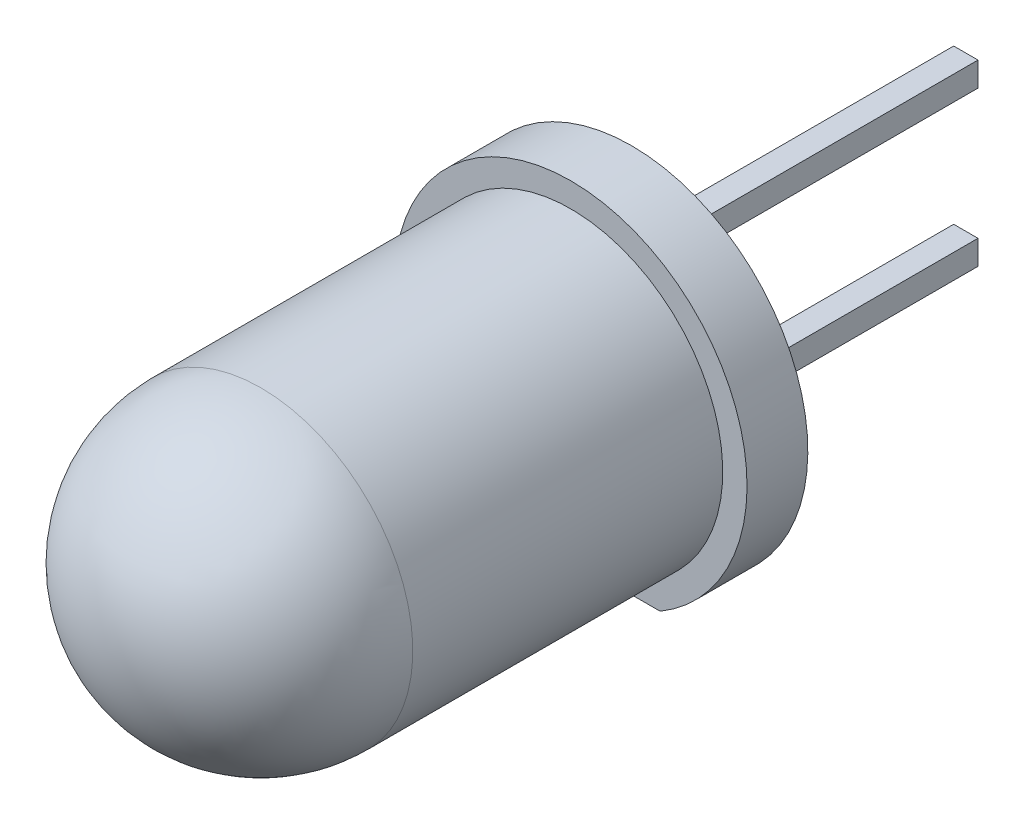
ISO-10303-21;
HEADER;
FILE_DESCRIPTION(('STEP AP214'),'2;1');
FILE_NAME('part.step','',(''),(''),'','','');
FILE_SCHEMA(('AUTOMOTIVE_DESIGN { 1 0 10303 214 1 1 1 1 }'));
ENDSEC;
DATA;
#1=APPLICATION_CONTEXT('core data for automotive mechanical design processes');
#2=APPLICATION_PROTOCOL_DEFINITION('international standard','automotive_design',2000,#1);
#3=PRODUCT_CONTEXT('',#1,'mechanical');
#4=PRODUCT('Part','Part','',(#3));
#5=PRODUCT_RELATED_PRODUCT_CATEGORY('part','',(#4));
#6=PRODUCT_DEFINITION_FORMATION('','',#4);
#7=PRODUCT_DEFINITION_CONTEXT('part definition',#1,'design');
#8=PRODUCT_DEFINITION('design','',#6,#7);
#9=PRODUCT_DEFINITION_SHAPE('','',#8);
#10=(LENGTH_UNIT() NAMED_UNIT(*) SI_UNIT(.MILLI.,.METRE.));
#11=(NAMED_UNIT(*) PLANE_ANGLE_UNIT() SI_UNIT($,.RADIAN.));
#12=(NAMED_UNIT(*) SI_UNIT($,.STERADIAN.) SOLID_ANGLE_UNIT());
#13=UNCERTAINTY_MEASURE_WITH_UNIT(LENGTH_MEASURE(1.E-05),#10,'distance_accuracy_value','');
#14=(GEOMETRIC_REPRESENTATION_CONTEXT(3) GLOBAL_UNCERTAINTY_ASSIGNED_CONTEXT((#13)) GLOBAL_UNIT_ASSIGNED_CONTEXT((#10,
#11,#12)) REPRESENTATION_CONTEXT('',''));
#15=CARTESIAN_POINT('',(0.,0.,0.));
#16=DIRECTION('',(0.,0.,1.));
#17=DIRECTION('',(1.,0.,0.));
#18=AXIS2_PLACEMENT_3D('',#15,#16,#17);
#19=CARTESIAN_POINT('',(9.2,-6.26,3.5));
#20=DIRECTION('',(-1.,0.,0.));
#21=DIRECTION('',(0.,-1.,0.));
#22=AXIS2_PLACEMENT_3D('',#19,#20,#21);
#23=PLANE('',#22);
#24=DIRECTION('',(0.,1.,0.));
#25=VECTOR('',#24,1.);
#26=CARTESIAN_POINT('',(9.2,-6.66,-2.5));
#27=LINE('',#26,#25);
#28=CARTESIAN_POINT('',(9.2,-6.66,-2.5));
#29=VERTEX_POINT('',#28);
#30=CARTESIAN_POINT('',(9.2,-6.26,-2.5));
#31=VERTEX_POINT('',#30);
#32=EDGE_CURVE('E117',#29,#31,#27,.T.);
#33=ORIENTED_EDGE('',*,*,#32,.T.);
#34=DIRECTION('',(0.,0.,1.));
#35=VECTOR('',#34,1.);
#36=CARTESIAN_POINT('',(9.2,-6.26,3.5));
#37=LINE('',#36,#35);
#38=CARTESIAN_POINT('',(9.2,-6.26,3.));
#39=VERTEX_POINT('',#38);
#40=EDGE_CURVE('E109',#31,#39,#37,.T.);
#41=ORIENTED_EDGE('',*,*,#40,.T.);
#42=DIRECTION('',(0.,-1.,0.));
#43=VECTOR('',#42,1.);
#44=CARTESIAN_POINT('',(9.2,-6.26,3.));
#45=LINE('',#44,#43);
#46=CARTESIAN_POINT('',(9.2,-6.66,3.));
#47=VERTEX_POINT('',#46);
#48=EDGE_CURVE('E99',#47,#39,#45,.F.);
#49=ORIENTED_EDGE('',*,*,#48,.F.);
#50=DIRECTION('',(0.,0.,1.));
#51=VECTOR('',#50,1.);
#52=CARTESIAN_POINT('',(9.2,-6.66,3.5));
#53=LINE('',#52,#51);
#54=EDGE_CURVE('E89',#47,#29,#53,.F.);
#55=ORIENTED_EDGE('',*,*,#54,.T.);
#56=EDGE_LOOP('',(#33,#41,#49,#55));
#57=FACE_BOUND('',#56,.T.);
#58=ADVANCED_FACE('F17',(#57),#23,.F.);
#59=CARTESIAN_POINT('',(9.2,-4.12,3.5));
#60=DIRECTION('',(0.,1.,0.));
#61=DIRECTION('',(-1.,0.,0.));
#62=AXIS2_PLACEMENT_3D('',#59,#60,#61);
#63=PLANE('',#62);
#64=DIRECTION('',(1.,0.,0.));
#65=VECTOR('',#64,1.);
#66=CARTESIAN_POINT('',(8.8,-4.12,-2.5));
#67=LINE('',#66,#65);
#68=CARTESIAN_POINT('',(8.8,-4.12,-2.5));
#69=VERTEX_POINT('',#68);
#70=CARTESIAN_POINT('',(9.2,-4.12,-2.5));
#71=VERTEX_POINT('',#70);
#72=EDGE_CURVE('E68',#69,#71,#67,.T.);
#73=ORIENTED_EDGE('',*,*,#72,.T.);
#74=DIRECTION('',(0.,0.,1.));
#75=VECTOR('',#74,1.);
#76=CARTESIAN_POINT('',(9.2,-4.12,3.5));
#77=LINE('',#76,#75);
#78=CARTESIAN_POINT('',(9.2,-4.12,3.));
#79=VERTEX_POINT('',#78);
#80=EDGE_CURVE('E162',#71,#79,#77,.T.);
#81=ORIENTED_EDGE('',*,*,#80,.T.);
#82=DIRECTION('',(-1.,0.,0.));
#83=VECTOR('',#82,1.);
#84=CARTESIAN_POINT('',(9.2,-4.12,3.));
#85=LINE('',#84,#83);
#86=CARTESIAN_POINT('',(8.8,-4.12,3.));
#87=VERTEX_POINT('',#86);
#88=EDGE_CURVE('E106',#87,#79,#85,.F.);
#89=ORIENTED_EDGE('',*,*,#88,.F.);
#90=DIRECTION('',(0.,0.,1.));
#91=VECTOR('',#90,1.);
#92=CARTESIAN_POINT('',(8.8,-4.12,3.5));
#93=LINE('',#92,#91);
#94=EDGE_CURVE('E173',#87,#69,#93,.F.);
#95=ORIENTED_EDGE('',*,*,#94,.T.);
#96=EDGE_LOOP('',(#73,#81,#89,#95));
#97=FACE_BOUND('',#96,.T.);
#98=ADVANCED_FACE('F216',(#97),#63,.F.);
#99=CARTESIAN_POINT('',(9.2,-6.66,3.5));
#100=DIRECTION('',(0.,1.,0.));
#101=DIRECTION('',(-1.,0.,0.));
#102=AXIS2_PLACEMENT_3D('',#99,#100,#101);
#103=PLANE('',#102);
#104=DIRECTION('',(1.,0.,0.));
#105=VECTOR('',#104,1.);
#106=CARTESIAN_POINT('',(8.8,-6.66,-2.5));
#107=LINE('',#106,#105);
#108=CARTESIAN_POINT('',(8.8,-6.66,-2.5));
#109=VERTEX_POINT('',#108);
#110=EDGE_CURVE('E114',#109,#29,#107,.T.);
#111=ORIENTED_EDGE('',*,*,#110,.T.);
#112=ORIENTED_EDGE('',*,*,#54,.F.);
#113=DIRECTION('',(-1.,0.,0.));
#114=VECTOR('',#113,1.);
#115=CARTESIAN_POINT('',(9.2,-6.66,3.));
#116=LINE('',#115,#114);
#117=CARTESIAN_POINT('',(8.8,-6.66,3.));
#118=VERTEX_POINT('',#117);
#119=EDGE_CURVE('E95',#118,#47,#116,.F.);
#120=ORIENTED_EDGE('',*,*,#119,.F.);
#121=DIRECTION('',(0.,0.,1.));
#122=VECTOR('',#121,1.);
#123=CARTESIAN_POINT('',(8.8,-6.66,3.5));
#124=LINE('',#123,#122);
#125=EDGE_CURVE('E157',#118,#109,#124,.F.);
#126=ORIENTED_EDGE('',*,*,#125,.T.);
#127=EDGE_LOOP('',(#111,#112,#120,#126));
#128=FACE_BOUND('',#127,.T.);
#129=ADVANCED_FACE('F112',(#128),#103,.F.);
#130=CARTESIAN_POINT('',(8.8,-6.66,-2.5));
#131=DIRECTION('',(0.,0.,1.));
#132=DIRECTION('',(1.,0.,0.));
#133=AXIS2_PLACEMENT_3D('',#130,#131,#132);
#134=PLANE('',#133);
#135=DIRECTION('',(1.,0.,0.));
#136=VECTOR('',#135,1.);
#137=CARTESIAN_POINT('',(8.8,-6.26,-2.5));
#138=LINE('',#137,#136);
#139=CARTESIAN_POINT('',(8.8,-6.26,-2.5));
#140=VERTEX_POINT('',#139);
#141=EDGE_CURVE('E178',#140,#31,#138,.T.);
#142=ORIENTED_EDGE('',*,*,#141,.T.);
#143=ORIENTED_EDGE('',*,*,#32,.F.);
#144=ORIENTED_EDGE('',*,*,#110,.F.);
#145=DIRECTION('',(0.,1.,0.));
#146=VECTOR('',#145,1.);
#147=CARTESIAN_POINT('',(8.8,-6.66,-2.5));
#148=LINE('',#147,#146);
#149=EDGE_CURVE('E154',#109,#140,#148,.T.);
#150=ORIENTED_EDGE('',*,*,#149,.T.);
#151=EDGE_LOOP('',(#142,#143,#144,#150));
#152=FACE_BOUND('',#151,.T.);
#153=ADVANCED_FACE('F184',(#152),#134,.F.);
#154=CARTESIAN_POINT('',(8.8,-6.26,3.5));
#155=DIRECTION('',(0.,-1.,0.));
#156=DIRECTION('',(1.,0.,0.));
#157=AXIS2_PLACEMENT_3D('',#154,#155,#156);
#158=PLANE('',#157);
#159=ORIENTED_EDGE('',*,*,#141,.F.);
#160=DIRECTION('',(0.,0.,1.));
#161=VECTOR('',#160,1.);
#162=CARTESIAN_POINT('',(8.8,-6.26,3.5));
#163=LINE('',#162,#161);
#164=CARTESIAN_POINT('',(8.8,-6.26,3.));
#165=VERTEX_POINT('',#164);
#166=EDGE_CURVE('E151',#140,#165,#163,.T.);
#167=ORIENTED_EDGE('',*,*,#166,.T.);
#168=DIRECTION('',(1.,0.,0.));
#169=VECTOR('',#168,1.);
#170=CARTESIAN_POINT('',(8.8,-6.26,3.));
#171=LINE('',#170,#169);
#172=EDGE_CURVE('E181',#39,#165,#171,.F.);
#173=ORIENTED_EDGE('',*,*,#172,.F.);
#174=ORIENTED_EDGE('',*,*,#40,.F.);
#175=EDGE_LOOP('',(#159,#167,#173,#174));
#176=FACE_BOUND('',#175,.T.);
#177=ADVANCED_FACE('F188',(#176),#158,.F.);
#178=CARTESIAN_POINT('',(8.8,-4.12,3.5));
#179=DIRECTION('',(1.,0.,0.));
#180=DIRECTION('',(0.,1.,0.));
#181=AXIS2_PLACEMENT_3D('',#178,#179,#180);
#182=PLANE('',#181);
#183=DIRECTION('',(0.,1.,0.));
#184=VECTOR('',#183,1.);
#185=CARTESIAN_POINT('',(8.8,-4.12,-2.5));
#186=LINE('',#185,#184);
#187=CARTESIAN_POINT('',(8.8,-3.72,-2.5));
#188=VERTEX_POINT('',#187);
#189=EDGE_CURVE('E169',#188,#69,#186,.F.);
#190=ORIENTED_EDGE('',*,*,#189,.T.);
#191=ORIENTED_EDGE('',*,*,#94,.F.);
#192=DIRECTION('',(0.,1.,0.));
#193=VECTOR('',#192,1.);
#194=CARTESIAN_POINT('',(8.8,-4.12,3.));
#195=LINE('',#194,#193);
#196=CARTESIAN_POINT('',(8.8,-3.72,3.));
#197=VERTEX_POINT('',#196);
#198=EDGE_CURVE('E175',#197,#87,#195,.F.);
#199=ORIENTED_EDGE('',*,*,#198,.F.);
#200=DIRECTION('',(0.,0.,1.));
#201=VECTOR('',#200,1.);
#202=CARTESIAN_POINT('',(8.8,-3.72,3.5));
#203=LINE('',#202,#201);
#204=EDGE_CURVE('E148',#197,#188,#203,.F.);
#205=ORIENTED_EDGE('',*,*,#204,.T.);
#206=EDGE_LOOP('',(#190,#191,#199,#205));
#207=FACE_BOUND('',#206,.T.);
#208=ADVANCED_FACE('F202',(#207),#182,.F.);
#209=CARTESIAN_POINT('',(8.8,-4.12,-2.5));
#210=DIRECTION('',(0.,0.,1.));
#211=DIRECTION('',(1.,0.,0.));
#212=AXIS2_PLACEMENT_3D('',#209,#210,#211);
#213=PLANE('',#212);
#214=DIRECTION('',(1.,0.,0.));
#215=VECTOR('',#214,1.);
#216=CARTESIAN_POINT('',(8.8,-3.72,-2.5));
#217=LINE('',#216,#215);
#218=CARTESIAN_POINT('',(9.2,-3.72,-2.5));
#219=VERTEX_POINT('',#218);
#220=EDGE_CURVE('E145',#188,#219,#217,.T.);
#221=ORIENTED_EDGE('',*,*,#220,.T.);
#222=DIRECTION('',(0.,-1.,0.));
#223=VECTOR('',#222,1.);
#224=CARTESIAN_POINT('',(9.2,-3.72,-2.5));
#225=LINE('',#224,#223);
#226=EDGE_CURVE('E165',#219,#71,#225,.T.);
#227=ORIENTED_EDGE('',*,*,#226,.T.);
#228=ORIENTED_EDGE('',*,*,#72,.F.);
#229=ORIENTED_EDGE('',*,*,#189,.F.);
#230=EDGE_LOOP('',(#221,#227,#228,#229));
#231=FACE_BOUND('',#230,.T.);
#232=ADVANCED_FACE('F207',(#231),#213,.F.);
#233=CARTESIAN_POINT('',(9.2,-3.72,3.5));
#234=DIRECTION('',(-1.,0.,0.));
#235=DIRECTION('',(0.,-1.,0.));
#236=AXIS2_PLACEMENT_3D('',#233,#234,#235);
#237=PLANE('',#236);
#238=ORIENTED_EDGE('',*,*,#226,.F.);
#239=DIRECTION('',(0.,0.,1.));
#240=VECTOR('',#239,1.);
#241=CARTESIAN_POINT('',(9.2,-3.72,3.5));
#242=LINE('',#241,#240);
#243=CARTESIAN_POINT('',(9.2,-3.72,3.));
#244=VERTEX_POINT('',#243);
#245=EDGE_CURVE('E142',#219,#244,#242,.T.);
#246=ORIENTED_EDGE('',*,*,#245,.T.);
#247=DIRECTION('',(0.,-1.,0.));
#248=VECTOR('',#247,1.);
#249=CARTESIAN_POINT('',(9.2,-3.72,3.));
#250=LINE('',#249,#248);
#251=EDGE_CURVE('E167',#79,#244,#250,.F.);
#252=ORIENTED_EDGE('',*,*,#251,.F.);
#253=ORIENTED_EDGE('',*,*,#80,.F.);
#254=EDGE_LOOP('',(#238,#246,#252,#253));
#255=FACE_BOUND('',#254,.T.);
#256=ADVANCED_FACE('F213',(#255),#237,.F.);
#257=CARTESIAN_POINT('',(10.46969384567,-7.689999999999,3.));
#258=DIRECTION('',(0.,-1.,0.));
#259=DIRECTION('',(1.,0.,0.));
#260=AXIS2_PLACEMENT_3D('',#257,#258,#259);
#261=PLANE('',#260);
#262=DIRECTION('',(0.,0.,1.));
#263=VECTOR('',#262,1.);
#264=CARTESIAN_POINT('',(7.530306154331,-7.689999999999,3.));
#265=LINE('',#264,#263);
#266=CARTESIAN_POINT('',(7.5303061543297,-7.689999999999,4.));
#267=VERTEX_POINT('',#266);
#268=CARTESIAN_POINT('',(7.5303061543297,-7.689999999999,3.));
#269=VERTEX_POINT('',#268);
#270=EDGE_CURVE('E52',#267,#269,#265,.F.);
#271=ORIENTED_EDGE('',*,*,#270,.T.);
#272=DIRECTION('',(-1.,0.,0.));
#273=VECTOR('',#272,1.);
#274=CARTESIAN_POINT('',(10.469693845671,-7.689999999999,3.));
#275=LINE('',#274,#273);
#276=CARTESIAN_POINT('',(10.4696938456708,-7.689999999999,3.));
#277=VERTEX_POINT('',#276);
#278=EDGE_CURVE('E134',#277,#269,#275,.T.);
#279=ORIENTED_EDGE('',*,*,#278,.F.);
#280=DIRECTION('',(0.,0.,1.));
#281=VECTOR('',#280,1.);
#282=CARTESIAN_POINT('',(10.46969384567,-7.689999999999,3.));
#283=LINE('',#282,#281);
#284=CARTESIAN_POINT('',(10.4696938456708,-7.689999999999,4.));
#285=VERTEX_POINT('',#284);
#286=EDGE_CURVE('E159',#277,#285,#283,.T.);
#287=ORIENTED_EDGE('',*,*,#286,.T.);
#288=DIRECTION('',(1.,0.,0.));
#289=VECTOR('',#288,1.);
#290=CARTESIAN_POINT('',(10.46969384567,-7.689999999999,4.));
#291=LINE('',#290,#289);
#292=EDGE_CURVE('E20',#285,#267,#291,.F.);
#293=ORIENTED_EDGE('',*,*,#292,.T.);
#294=EDGE_LOOP('',(#271,#279,#287,#293));
#295=FACE_BOUND('',#294,.T.);
#296=ADVANCED_FACE('F249',(#295),#261,.T.);
#297=CARTESIAN_POINT('',(8.8,-6.66,3.5));
#298=DIRECTION('',(1.,0.,0.));
#299=DIRECTION('',(0.,1.,0.));
#300=AXIS2_PLACEMENT_3D('',#297,#298,#299);
#301=PLANE('',#300);
#302=ORIENTED_EDGE('',*,*,#149,.F.);
#303=ORIENTED_EDGE('',*,*,#125,.F.);
#304=DIRECTION('',(0.,1.,0.));
#305=VECTOR('',#304,1.);
#306=CARTESIAN_POINT('',(8.8,-7.689999999999,3.));
#307=LINE('',#306,#305);
#308=EDGE_CURVE('E103',#165,#118,#307,.F.);
#309=ORIENTED_EDGE('',*,*,#308,.F.);
#310=ORIENTED_EDGE('',*,*,#166,.F.);
#311=EDGE_LOOP('',(#302,#303,#309,#310));
#312=FACE_BOUND('',#311,.T.);
#313=ADVANCED_FACE('F246',(#312),#301,.F.);
#314=CARTESIAN_POINT('',(8.8,-3.72,3.5));
#315=DIRECTION('',(0.,-1.,0.));
#316=DIRECTION('',(1.,0.,0.));
#317=AXIS2_PLACEMENT_3D('',#314,#315,#316);
#318=PLANE('',#317);
#319=ORIENTED_EDGE('',*,*,#220,.F.);
#320=ORIENTED_EDGE('',*,*,#204,.F.);
#321=DIRECTION('',(-1.,0.,0.));
#322=VECTOR('',#321,1.);
#323=CARTESIAN_POINT('',(10.469693845671,-3.72,3.));
#324=LINE('',#323,#322);
#325=EDGE_CURVE('E126',#244,#197,#324,.T.);
#326=ORIENTED_EDGE('',*,*,#325,.F.);
#327=ORIENTED_EDGE('',*,*,#245,.F.);
#328=EDGE_LOOP('',(#319,#320,#326,#327));
#329=FACE_BOUND('',#328,.T.);
#330=ADVANCED_FACE('F210',(#329),#318,.F.);
#331=CARTESIAN_POINT('',(10.469693845671,-7.689999999999,3.));
#332=DIRECTION('',(0.,0.,-1.));
#333=DIRECTION('',(-1.,0.,0.));
#334=AXIS2_PLACEMENT_3D('',#331,#332,#333);
#335=PLANE('',#334);
#336=ORIENTED_EDGE('',*,*,#251,.T.);
#337=ORIENTED_EDGE('',*,*,#325,.T.);
#338=ORIENTED_EDGE('',*,*,#198,.T.);
#339=ORIENTED_EDGE('',*,*,#88,.T.);
#340=EDGE_LOOP('',(#336,#337,#338,#339));
#341=FACE_BOUND('',#340,.T.);
#342=ORIENTED_EDGE('',*,*,#172,.T.);
#343=ORIENTED_EDGE('',*,*,#308,.T.);
#344=ORIENTED_EDGE('',*,*,#119,.T.);
#345=ORIENTED_EDGE('',*,*,#48,.T.);
#346=EDGE_LOOP('',(#342,#343,#344,#345));
#347=FACE_BOUND('',#346,.T.);
#348=CARTESIAN_POINT('',(9.,-5.19,3.));
#349=DIRECTION('',(0.,0.,-1.));
#350=DIRECTION('',(-1.,0.,0.));
#351=AXIS2_PLACEMENT_3D('',#348,#349,#350);
#352=CIRCLE('',#351,2.9);
#353=EDGE_CURVE('E125',#277,#269,#352,.F.);
#354=ORIENTED_EDGE('',*,*,#353,.F.);
#355=ORIENTED_EDGE('',*,*,#278,.T.);
#356=EDGE_LOOP('',(#354,#355));
#357=FACE_BOUND('',#356,.T.);
#358=ADVANCED_FACE('F97',(#341,#347,#357),#335,.T.);
#359=CARTESIAN_POINT('',(9.,-5.19,3.));
#360=DIRECTION('',(0.,0.,-1.));
#361=DIRECTION('',(-1.,0.,0.));
#362=AXIS2_PLACEMENT_3D('',#359,#360,#361);
#363=CYLINDRICAL_SURFACE('',#362,2.9);
#364=CARTESIAN_POINT('',(9.,-5.19,4.));
#365=DIRECTION('',(0.,0.,-1.));
#366=DIRECTION('',(-1.,0.,0.));
#367=AXIS2_PLACEMENT_3D('',#364,#365,#366);
#368=CIRCLE('',#367,2.9);
#369=EDGE_CURVE('E124',#267,#285,#368,.T.);
#370=ORIENTED_EDGE('',*,*,#369,.T.);
#371=ORIENTED_EDGE('',*,*,#286,.F.);
#372=ORIENTED_EDGE('',*,*,#353,.T.);
#373=ORIENTED_EDGE('',*,*,#270,.F.);
#374=EDGE_LOOP('',(#370,#371,#372,#373));
#375=FACE_BOUND('',#374,.T.);
#376=ADVANCED_FACE('F239',(#375),#363,.T.);
#377=CARTESIAN_POINT('',(9.,-5.19,9.1));
#378=DIRECTION('',(0.,1.,0.));
#379=DIRECTION('',(-1.,0.,0.));
#380=AXIS2_PLACEMENT_3D('',#377,#378,#379);
#381=SPHERICAL_SURFACE('',#380,2.5);
#382=CARTESIAN_POINT('',(9.,-5.19,9.1));
#383=DIRECTION('',(0.,0.,-1.));
#384=DIRECTION('',(-1.,0.,0.));
#385=AXIS2_PLACEMENT_3D('',#382,#383,#384);
#386=CIRCLE('',#385,2.5);
#387=CARTESIAN_POINT('',(9.,-2.69,9.1));
#388=VERTEX_POINT('',#387);
#389=CARTESIAN_POINT('',(9.00000000000001,-7.69,9.1));
#390=VERTEX_POINT('',#389);
#391=EDGE_CURVE('E123',#388,#390,#386,.T.);
#392=ORIENTED_EDGE('',*,*,#391,.F.);
#393=CARTESIAN_POINT('',(9.,-5.19,9.1));
#394=DIRECTION('',(0.,0.,-1.));
#395=DIRECTION('',(-1.,0.,0.));
#396=AXIS2_PLACEMENT_3D('',#393,#394,#395);
#397=CIRCLE('',#396,2.5);
#398=EDGE_CURVE('E26',#390,#388,#397,.T.);
#399=ORIENTED_EDGE('',*,*,#398,.F.);
#400=EDGE_LOOP('',(#392,#399));
#401=FACE_BOUND('',#400,.T.);
#402=ADVANCED_FACE('F232',(#401),#381,.T.);
#403=CARTESIAN_POINT('',(10.469693845671,-7.689999999999,4.));
#404=DIRECTION('',(0.,0.,-1.));
#405=DIRECTION('',(-1.,0.,0.));
#406=AXIS2_PLACEMENT_3D('',#403,#404,#405);
#407=PLANE('',#406);
#408=CARTESIAN_POINT('',(9.,-5.19,4.));
#409=DIRECTION('',(0.,0.,-1.));
#410=DIRECTION('',(-1.,0.,0.));
#411=AXIS2_PLACEMENT_3D('',#408,#409,#410);
#412=CIRCLE('',#411,2.5);
#413=CARTESIAN_POINT('',(6.5,-5.19,4.));
#414=VERTEX_POINT('',#413);
#415=EDGE_CURVE('E11',#414,#414,#412,.F.);
#416=ORIENTED_EDGE('',*,*,#415,.F.);
#417=EDGE_LOOP('',(#416));
#418=FACE_BOUND('',#417,.T.);
#419=ORIENTED_EDGE('',*,*,#292,.F.);
#420=ORIENTED_EDGE('',*,*,#369,.F.);
#421=EDGE_LOOP('',(#419,#420));
#422=FACE_BOUND('',#421,.T.);
#423=ADVANCED_FACE('F226',(#418,#422),#407,.F.);
#424=CARTESIAN_POINT('',(9.,-5.19,9.1));
#425=DIRECTION('',(0.,0.,-1.));
#426=DIRECTION('',(-1.,0.,0.));
#427=AXIS2_PLACEMENT_3D('',#424,#425,#426);
#428=CYLINDRICAL_SURFACE('',#427,2.5);
#429=ORIENTED_EDGE('',*,*,#398,.T.);
#430=ORIENTED_EDGE('',*,*,#391,.T.);
#431=EDGE_LOOP('',(#429,#430));
#432=FACE_BOUND('',#431,.T.);
#433=ORIENTED_EDGE('',*,*,#415,.T.);
#434=EDGE_LOOP('',(#433));
#435=FACE_BOUND('',#434,.T.);
#436=ADVANCED_FACE('F224',(#432,#435),#428,.T.);
#437=CLOSED_SHELL('',(#58,#98,#129,#153,#177,#208,#232,#256,#296,#313,#330,#358,#376,#402,#423,#436));
#438=MANIFOLD_SOLID_BREP('B1',#437);
#439=ADVANCED_BREP_SHAPE_REPRESENTATION('',(#18,#438),#14);
#440=SHAPE_DEFINITION_REPRESENTATION(#9,#439);
ENDSEC;
END-ISO-10303-21;
